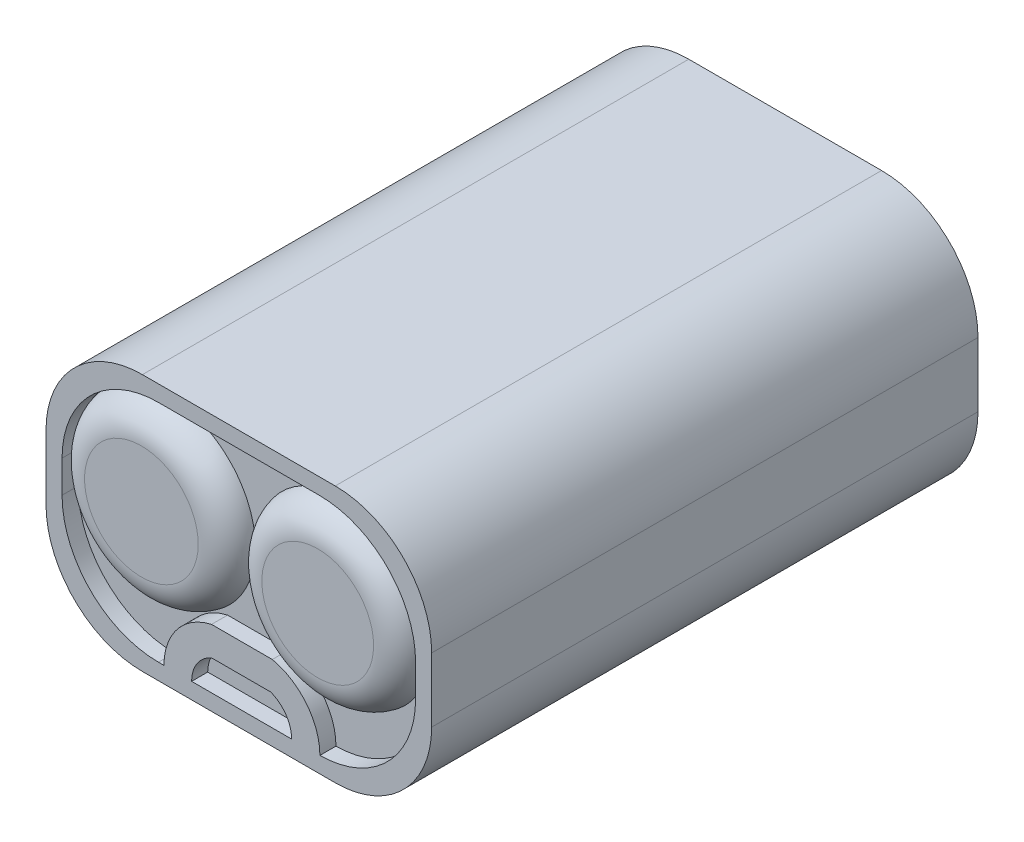
ISO-10303-21;
HEADER;
FILE_DESCRIPTION(('STEP AP214'),'2;1');
FILE_NAME('part.step','',(''),(''),'','','');
FILE_SCHEMA(('AUTOMOTIVE_DESIGN { 1 0 10303 214 1 1 1 1 }'));
ENDSEC;
DATA;
#1=APPLICATION_CONTEXT('core data for automotive mechanical design processes');
#2=APPLICATION_PROTOCOL_DEFINITION('international standard','automotive_design',2000,#1);
#3=PRODUCT_CONTEXT('',#1,'mechanical');
#4=PRODUCT('Part','Part','',(#3));
#5=PRODUCT_RELATED_PRODUCT_CATEGORY('part','',(#4));
#6=PRODUCT_DEFINITION_FORMATION('','',#4);
#7=PRODUCT_DEFINITION_CONTEXT('part definition',#1,'design');
#8=PRODUCT_DEFINITION('design','',#6,#7);
#9=PRODUCT_DEFINITION_SHAPE('','',#8);
#10=(LENGTH_UNIT() NAMED_UNIT(*) SI_UNIT(.MILLI.,.METRE.));
#11=(NAMED_UNIT(*) PLANE_ANGLE_UNIT() SI_UNIT($,.RADIAN.));
#12=(NAMED_UNIT(*) SI_UNIT($,.STERADIAN.) SOLID_ANGLE_UNIT());
#13=UNCERTAINTY_MEASURE_WITH_UNIT(LENGTH_MEASURE(1.E-05),#10,'distance_accuracy_value','');
#14=(GEOMETRIC_REPRESENTATION_CONTEXT(3) GLOBAL_UNCERTAINTY_ASSIGNED_CONTEXT((#13)) GLOBAL_UNIT_ASSIGNED_CONTEXT((#10,
#11,#12)) REPRESENTATION_CONTEXT('',''));
#15=CARTESIAN_POINT('',(0.,0.,0.));
#16=DIRECTION('',(0.,0.,1.));
#17=DIRECTION('',(1.,0.,0.));
#18=AXIS2_PLACEMENT_3D('',#15,#16,#17);
#19=CARTESIAN_POINT('',(15.24,20.32,21.59));
#20=DIRECTION('',(0.,0.,-1.));
#21=DIRECTION('',(-1.,0.,0.));
#22=AXIS2_PLACEMENT_3D('',#19,#20,#21);
#23=PLANE('',#22);
#24=DIRECTION('',(-1.,0.,0.));
#25=VECTOR('',#24,1.);
#26=CARTESIAN_POINT('',(0.,1.27,21.59));
#27=LINE('',#26,#25);
#28=CARTESIAN_POINT('',(4.17309607674067,1.27,21.59));
#29=VERTEX_POINT('',#28);
#30=CARTESIAN_POINT('',(-3.72973394839506,1.27,21.59));
#31=VERTEX_POINT('',#30);
#32=EDGE_CURVE('E106',#29,#31,#27,.T.);
#33=ORIENTED_EDGE('',*,*,#32,.T.);
#34=CARTESIAN_POINT('',(-1.11982693027526,1.27,21.59));
#35=DIRECTION('',(0.,0.,1.));
#36=DIRECTION('',(1.,0.,0.));
#37=AXIS2_PLACEMENT_3D('',#34,#35,#36);
#38=CIRCLE('',#37,2.6099070181198);
#39=CARTESIAN_POINT('',(-2.15658026023139,3.66515285024899,21.59));
#40=VERTEX_POINT('',#39);
#41=EDGE_CURVE('E334',#40,#31,#38,.T.);
#42=ORIENTED_EDGE('',*,*,#41,.F.);
#43=DIRECTION('',(1.,0.,0.));
#44=VECTOR('',#43,1.);
#45=CARTESIAN_POINT('',(0.,3.66515285024899,21.59));
#46=LINE('',#45,#44);
#47=CARTESIAN_POINT('',(2.52500779474754,3.66515285024899,21.59));
#48=VERTEX_POINT('',#47);
#49=EDGE_CURVE('E347',#40,#48,#46,.T.);
#50=ORIENTED_EDGE('',*,*,#49,.T.);
#51=CARTESIAN_POINT('',(1.60862418113436,1.27,21.59));
#52=DIRECTION('',(0.,0.,1.));
#53=DIRECTION('',(1.,0.,0.));
#54=AXIS2_PLACEMENT_3D('',#51,#52,#53);
#55=CIRCLE('',#54,2.56447189560631);
#56=EDGE_CURVE('E344',#29,#48,#55,.T.);
#57=ORIENTED_EDGE('',*,*,#56,.F.);
#58=EDGE_LOOP('',(#33,#42,#50,#57));
#59=FACE_BOUND('',#58,.T.);
#60=DIRECTION('',(1.,0.,0.));
#61=VECTOR('',#60,1.);
#62=CARTESIAN_POINT('',(15.24,0.,21.59));
#63=LINE('',#62,#61);
#64=CARTESIAN_POINT('',(-7.62,0.,21.59));
#65=VERTEX_POINT('',#64);
#66=CARTESIAN_POINT('',(7.62,0.,21.59));
#67=VERTEX_POINT('',#66);
#68=EDGE_CURVE('E354',#65,#67,#63,.T.);
#69=ORIENTED_EDGE('',*,*,#68,.T.);
#70=CARTESIAN_POINT('',(7.61999999999999,7.62,21.59));
#71=DIRECTION('',(0.,0.,-1.));
#72=DIRECTION('',(-1.,0.,0.));
#73=AXIS2_PLACEMENT_3D('',#70,#71,#72);
#74=CIRCLE('',#73,7.62);
#75=CARTESIAN_POINT('',(15.24,7.62,21.59));
#76=VERTEX_POINT('',#75);
#77=EDGE_CURVE('E406',#67,#76,#74,.F.);
#78=ORIENTED_EDGE('',*,*,#77,.T.);
#79=DIRECTION('',(0.,-1.,0.));
#80=VECTOR('',#79,1.);
#81=CARTESIAN_POINT('',(15.24,20.32,21.59));
#82=LINE('',#81,#80);
#83=CARTESIAN_POINT('',(15.24,12.7,21.59));
#84=VERTEX_POINT('',#83);
#85=EDGE_CURVE('E377',#84,#76,#82,.T.);
#86=ORIENTED_EDGE('',*,*,#85,.F.);
#87=CARTESIAN_POINT('',(7.61999999999999,12.7,21.59));
#88=DIRECTION('',(0.,0.,-1.));
#89=DIRECTION('',(-1.,0.,0.));
#90=AXIS2_PLACEMENT_3D('',#87,#88,#89);
#91=CIRCLE('',#90,7.62);
#92=CARTESIAN_POINT('',(7.62,20.32,21.59));
#93=VERTEX_POINT('',#92);
#94=EDGE_CURVE('E402',#84,#93,#91,.F.);
#95=ORIENTED_EDGE('',*,*,#94,.T.);
#96=DIRECTION('',(1.,0.,0.));
#97=VECTOR('',#96,1.);
#98=CARTESIAN_POINT('',(15.24,20.32,21.59));
#99=LINE('',#98,#97);
#100=CARTESIAN_POINT('',(-7.62,20.32,21.59));
#101=VERTEX_POINT('',#100);
#102=EDGE_CURVE('E360',#101,#93,#99,.T.);
#103=ORIENTED_EDGE('',*,*,#102,.F.);
#104=CARTESIAN_POINT('',(-7.62,12.7,21.59));
#105=DIRECTION('',(0.,0.,-1.));
#106=DIRECTION('',(-1.,0.,0.));
#107=AXIS2_PLACEMENT_3D('',#104,#105,#106);
#108=CIRCLE('',#107,7.62);
#109=CARTESIAN_POINT('',(-15.24,12.7,21.59));
#110=VERTEX_POINT('',#109);
#111=EDGE_CURVE('E400',#101,#110,#108,.F.);
#112=ORIENTED_EDGE('',*,*,#111,.T.);
#113=DIRECTION('',(0.,-1.,0.));
#114=VECTOR('',#113,1.);
#115=CARTESIAN_POINT('',(-15.24,20.32,21.59));
#116=LINE('',#115,#114);
#117=CARTESIAN_POINT('',(-15.24,7.62,21.59));
#118=VERTEX_POINT('',#117);
#119=EDGE_CURVE('E380',#110,#118,#116,.T.);
#120=ORIENTED_EDGE('',*,*,#119,.T.);
#121=CARTESIAN_POINT('',(-7.62,7.62,21.59));
#122=DIRECTION('',(0.,0.,-1.));
#123=DIRECTION('',(-1.,0.,0.));
#124=AXIS2_PLACEMENT_3D('',#121,#122,#123);
#125=CIRCLE('',#124,7.62);
#126=EDGE_CURVE('E404',#118,#65,#125,.F.);
#127=ORIENTED_EDGE('',*,*,#126,.T.);
#128=EDGE_LOOP('',(#69,#78,#86,#95,#103,#112,#120,#127));
#129=FACE_BOUND('',#128,.T.);
#130=CARTESIAN_POINT('',(1.60862418113436,1.27,21.59));
#131=DIRECTION('',(0.,0.,1.));
#132=DIRECTION('',(1.,0.,0.));
#133=AXIS2_PLACEMENT_3D('',#130,#131,#132);
#134=CIRCLE('',#133,4.79908538804474);
#135=CARTESIAN_POINT('',(6.4077095642035,1.27021853291058,21.59));
#136=VERTEX_POINT('',#135);
#137=CARTESIAN_POINT('',(2.64537751109049,5.95576174112272,21.59));
#138=VERTEX_POINT('',#137);
#139=EDGE_CURVE('E98',#136,#138,#134,.T.);
#140=ORIENTED_EDGE('',*,*,#139,.T.);
#141=DIRECTION('',(1.,0.,0.));
#142=VECTOR('',#141,1.);
#143=CARTESIAN_POINT('',(0.,5.95576174112272,21.59));
#144=LINE('',#143,#142);
#145=CARTESIAN_POINT('',(-2.15658026023139,5.95576174112272,21.59));
#146=VERTEX_POINT('',#145);
#147=EDGE_CURVE('E255',#146,#138,#144,.T.);
#148=ORIENTED_EDGE('',*,*,#147,.F.);
#149=CARTESIAN_POINT('',(-1.11982693027526,1.27,21.59));
#150=DIRECTION('',(0.,0.,1.));
#151=DIRECTION('',(1.,0.,0.));
#152=AXIS2_PLACEMENT_3D('',#149,#150,#151);
#153=CIRCLE('',#152,4.79908538804474);
#154=CARTESIAN_POINT('',(-5.91891231832,1.27,21.59));
#155=VERTEX_POINT('',#154);
#156=EDGE_CURVE('E307',#146,#155,#153,.T.);
#157=ORIENTED_EDGE('',*,*,#156,.T.);
#158=DIRECTION('',(-1.,0.,0.));
#159=VECTOR('',#158,1.);
#160=CARTESIAN_POINT('',(0.,1.27,21.59));
#161=LINE('',#160,#159);
#162=CARTESIAN_POINT('',(-6.35,1.27,21.59));
#163=VERTEX_POINT('',#162);
#164=EDGE_CURVE('E304',#155,#163,#161,.T.);
#165=ORIENTED_EDGE('',*,*,#164,.T.);
#166=CARTESIAN_POINT('',(-6.35,8.89,21.59));
#167=DIRECTION('',(0.,0.,1.));
#168=DIRECTION('',(1.,0.,0.));
#169=AXIS2_PLACEMENT_3D('',#166,#167,#168);
#170=CIRCLE('',#169,7.62);
#171=CARTESIAN_POINT('',(-13.97,8.89,21.59));
#172=VERTEX_POINT('',#171);
#173=EDGE_CURVE('E301',#163,#172,#170,.F.);
#174=ORIENTED_EDGE('',*,*,#173,.T.);
#175=DIRECTION('',(0.,1.,0.));
#176=VECTOR('',#175,1.);
#177=CARTESIAN_POINT('',(-13.97,0.,21.59));
#178=LINE('',#177,#176);
#179=CARTESIAN_POINT('',(-13.97,11.43,21.59));
#180=VERTEX_POINT('',#179);
#181=EDGE_CURVE('E298',#172,#180,#178,.T.);
#182=ORIENTED_EDGE('',*,*,#181,.T.);
#183=CARTESIAN_POINT('',(-6.35,11.43,21.59));
#184=DIRECTION('',(0.,0.,1.));
#185=DIRECTION('',(1.,0.,0.));
#186=AXIS2_PLACEMENT_3D('',#183,#184,#185);
#187=CIRCLE('',#186,7.62);
#188=CARTESIAN_POINT('',(-6.35000000000001,19.05,21.59));
#189=VERTEX_POINT('',#188);
#190=EDGE_CURVE('E295',#189,#180,#187,.T.);
#191=ORIENTED_EDGE('',*,*,#190,.F.);
#192=DIRECTION('',(-1.,0.,0.));
#193=VECTOR('',#192,1.);
#194=CARTESIAN_POINT('',(0.,19.05,21.59));
#195=LINE('',#194,#193);
#196=CARTESIAN_POINT('',(6.35,19.05,21.59));
#197=VERTEX_POINT('',#196);
#198=EDGE_CURVE('E292',#197,#189,#195,.T.);
#199=ORIENTED_EDGE('',*,*,#198,.F.);
#200=CARTESIAN_POINT('',(6.35,11.43,21.59));
#201=DIRECTION('',(0.,0.,1.));
#202=DIRECTION('',(1.,0.,0.));
#203=AXIS2_PLACEMENT_3D('',#200,#201,#202);
#204=CIRCLE('',#203,7.62);
#205=CARTESIAN_POINT('',(13.97,11.43,21.59));
#206=VERTEX_POINT('',#205);
#207=EDGE_CURVE('E289',#206,#197,#204,.T.);
#208=ORIENTED_EDGE('',*,*,#207,.F.);
#209=DIRECTION('',(0.,1.,0.));
#210=VECTOR('',#209,1.);
#211=CARTESIAN_POINT('',(13.97,0.,21.59));
#212=LINE('',#211,#210);
#213=CARTESIAN_POINT('',(13.97,8.89,21.59));
#214=VERTEX_POINT('',#213);
#215=EDGE_CURVE('E286',#214,#206,#212,.T.);
#216=ORIENTED_EDGE('',*,*,#215,.F.);
#217=CARTESIAN_POINT('',(6.35,8.89,21.59));
#218=DIRECTION('',(0.,0.,1.));
#219=DIRECTION('',(1.,0.,0.));
#220=AXIS2_PLACEMENT_3D('',#217,#218,#219);
#221=CIRCLE('',#220,7.62);
#222=EDGE_CURVE('E283',#136,#214,#221,.T.);
#223=ORIENTED_EDGE('',*,*,#222,.F.);
#224=EDGE_LOOP('',(#140,#148,#157,#165,#174,#182,#191,#199,#208,#216,#223));
#225=FACE_BOUND('',#224,.T.);
#226=ADVANCED_FACE('F83',(#59,#129,#225),#23,.F.);
#227=CARTESIAN_POINT('',(-15.24,20.32,21.59));
#228=DIRECTION('',(1.,0.,0.));
#229=DIRECTION('',(0.,0.,-1.));
#230=AXIS2_PLACEMENT_3D('',#227,#228,#229);
#231=PLANE('',#230);
#232=DIRECTION('',(0.,-1.,0.));
#233=VECTOR('',#232,1.);
#234=CARTESIAN_POINT('',(-15.24,20.32,-21.59));
#235=LINE('',#234,#233);
#236=CARTESIAN_POINT('',(-15.24,12.7,-21.59));
#237=VERTEX_POINT('',#236);
#238=CARTESIAN_POINT('',(-15.24,7.62,-21.59));
#239=VERTEX_POINT('',#238);
#240=EDGE_CURVE('E367',#237,#239,#235,.T.);
#241=ORIENTED_EDGE('',*,*,#240,.T.);
#242=DIRECTION('',(0.,0.,1.));
#243=VECTOR('',#242,1.);
#244=CARTESIAN_POINT('',(-15.24,7.62,21.59));
#245=LINE('',#244,#243);
#246=EDGE_CURVE('E410',#239,#118,#245,.T.);
#247=ORIENTED_EDGE('',*,*,#246,.T.);
#248=ORIENTED_EDGE('',*,*,#119,.F.);
#249=DIRECTION('',(0.,0.,1.));
#250=VECTOR('',#249,1.);
#251=CARTESIAN_POINT('',(-15.24,12.7,-21.59));
#252=LINE('',#251,#250);
#253=EDGE_CURVE('E408',#110,#237,#252,.F.);
#254=ORIENTED_EDGE('',*,*,#253,.T.);
#255=EDGE_LOOP('',(#241,#247,#248,#254));
#256=FACE_BOUND('',#255,.T.);
#257=ADVANCED_FACE('F436',(#256),#231,.F.);
#258=CARTESIAN_POINT('',(15.24,20.32,21.59));
#259=DIRECTION('',(-1.,0.,0.));
#260=DIRECTION('',(0.,0.,1.));
#261=AXIS2_PLACEMENT_3D('',#258,#259,#260);
#262=PLANE('',#261);
#263=ORIENTED_EDGE('',*,*,#85,.T.);
#264=DIRECTION('',(0.,0.,-1.));
#265=VECTOR('',#264,1.);
#266=CARTESIAN_POINT('',(15.24,7.62,21.59));
#267=LINE('',#266,#265);
#268=CARTESIAN_POINT('',(15.24,7.62,-21.59));
#269=VERTEX_POINT('',#268);
#270=EDGE_CURVE('E385',#76,#269,#267,.T.);
#271=ORIENTED_EDGE('',*,*,#270,.T.);
#272=DIRECTION('',(0.,-1.,0.));
#273=VECTOR('',#272,1.);
#274=CARTESIAN_POINT('',(15.24,20.32,-21.59));
#275=LINE('',#274,#273);
#276=CARTESIAN_POINT('',(15.24,12.7,-21.59));
#277=VERTEX_POINT('',#276);
#278=EDGE_CURVE('E374',#277,#269,#275,.T.);
#279=ORIENTED_EDGE('',*,*,#278,.F.);
#280=DIRECTION('',(0.,0.,-1.));
#281=VECTOR('',#280,1.);
#282=CARTESIAN_POINT('',(15.24,12.7,21.59));
#283=LINE('',#282,#281);
#284=EDGE_CURVE('E383',#277,#84,#283,.F.);
#285=ORIENTED_EDGE('',*,*,#284,.T.);
#286=EDGE_LOOP('',(#263,#271,#279,#285));
#287=FACE_BOUND('',#286,.T.);
#288=ADVANCED_FACE('F442',(#287),#262,.F.);
#289=CARTESIAN_POINT('',(15.24,20.32,-21.59));
#290=DIRECTION('',(0.,0.,1.));
#291=DIRECTION('',(1.,0.,0.));
#292=AXIS2_PLACEMENT_3D('',#289,#290,#291);
#293=PLANE('',#292);
#294=ORIENTED_EDGE('',*,*,#278,.T.);
#295=CARTESIAN_POINT('',(7.61999999999999,7.62,-21.59));
#296=DIRECTION('',(0.,0.,1.));
#297=DIRECTION('',(1.,0.,0.));
#298=AXIS2_PLACEMENT_3D('',#295,#296,#297);
#299=CIRCLE('',#298,7.62);
#300=CARTESIAN_POINT('',(7.62,0.,-21.59));
#301=VERTEX_POINT('',#300);
#302=EDGE_CURVE('E394',#269,#301,#299,.F.);
#303=ORIENTED_EDGE('',*,*,#302,.T.);
#304=DIRECTION('',(-1.,0.,0.));
#305=VECTOR('',#304,1.);
#306=CARTESIAN_POINT('',(15.24,0.,-21.59));
#307=LINE('',#306,#305);
#308=CARTESIAN_POINT('',(-7.62,0.,-21.59));
#309=VERTEX_POINT('',#308);
#310=EDGE_CURVE('E364',#301,#309,#307,.T.);
#311=ORIENTED_EDGE('',*,*,#310,.T.);
#312=CARTESIAN_POINT('',(-7.62,7.62,-21.59));
#313=DIRECTION('',(0.,0.,1.));
#314=DIRECTION('',(1.,0.,0.));
#315=AXIS2_PLACEMENT_3D('',#312,#313,#314);
#316=CIRCLE('',#315,7.62);
#317=EDGE_CURVE('E392',#309,#239,#316,.F.);
#318=ORIENTED_EDGE('',*,*,#317,.T.);
#319=ORIENTED_EDGE('',*,*,#240,.F.);
#320=CARTESIAN_POINT('',(-7.62,12.7,-21.59));
#321=DIRECTION('',(0.,0.,1.));
#322=DIRECTION('',(1.,0.,0.));
#323=AXIS2_PLACEMENT_3D('',#320,#321,#322);
#324=CIRCLE('',#323,7.62);
#325=CARTESIAN_POINT('',(-7.62,20.32,-21.59));
#326=VERTEX_POINT('',#325);
#327=EDGE_CURVE('E388',#237,#326,#324,.F.);
#328=ORIENTED_EDGE('',*,*,#327,.T.);
#329=DIRECTION('',(-1.,0.,0.));
#330=VECTOR('',#329,1.);
#331=CARTESIAN_POINT('',(15.24,20.32,-21.59));
#332=LINE('',#331,#330);
#333=CARTESIAN_POINT('',(7.62,20.32,-21.59));
#334=VERTEX_POINT('',#333);
#335=EDGE_CURVE('E363',#334,#326,#332,.T.);
#336=ORIENTED_EDGE('',*,*,#335,.F.);
#337=CARTESIAN_POINT('',(7.61999999999999,12.7,-21.59));
#338=DIRECTION('',(0.,0.,1.));
#339=DIRECTION('',(1.,0.,0.));
#340=AXIS2_PLACEMENT_3D('',#337,#338,#339);
#341=CIRCLE('',#340,7.62);
#342=EDGE_CURVE('E390',#334,#277,#341,.F.);
#343=ORIENTED_EDGE('',*,*,#342,.T.);
#344=EDGE_LOOP('',(#294,#303,#311,#318,#319,#328,#336,#343));
#345=FACE_BOUND('',#344,.T.);
#346=ADVANCED_FACE('F476',(#345),#293,.F.);
#347=CARTESIAN_POINT('',(0.,20.32,0.));
#348=DIRECTION('',(0.,1.,0.));
#349=DIRECTION('',(0.,0.,1.));
#350=AXIS2_PLACEMENT_3D('',#347,#348,#349);
#351=PLANE('',#350);
#352=ORIENTED_EDGE('',*,*,#102,.T.);
#353=DIRECTION('',(0.,0.,-1.));
#354=VECTOR('',#353,1.);
#355=CARTESIAN_POINT('',(7.61999999999999,20.32,-21.59));
#356=LINE('',#355,#354);
#357=EDGE_CURVE('E416',#93,#334,#356,.T.);
#358=ORIENTED_EDGE('',*,*,#357,.T.);
#359=ORIENTED_EDGE('',*,*,#335,.T.);
#360=DIRECTION('',(0.,0.,1.));
#361=VECTOR('',#360,1.);
#362=CARTESIAN_POINT('',(-7.62,20.32,21.59));
#363=LINE('',#362,#361);
#364=EDGE_CURVE('E413',#326,#101,#363,.T.);
#365=ORIENTED_EDGE('',*,*,#364,.T.);
#366=EDGE_LOOP('',(#352,#358,#359,#365));
#367=FACE_BOUND('',#366,.T.);
#368=ADVANCED_FACE('F478',(#367),#351,.T.);
#369=CARTESIAN_POINT('',(0.,0.,0.));
#370=DIRECTION('',(0.,1.,0.));
#371=DIRECTION('',(0.,0.,1.));
#372=AXIS2_PLACEMENT_3D('',#369,#370,#371);
#373=PLANE('',#372);
#374=ORIENTED_EDGE('',*,*,#310,.F.);
#375=DIRECTION('',(0.,0.,-1.));
#376=VECTOR('',#375,1.);
#377=CARTESIAN_POINT('',(7.61999999999999,0.,0.));
#378=LINE('',#377,#376);
#379=EDGE_CURVE('E398',#301,#67,#378,.F.);
#380=ORIENTED_EDGE('',*,*,#379,.T.);
#381=ORIENTED_EDGE('',*,*,#68,.F.);
#382=DIRECTION('',(0.,0.,1.));
#383=VECTOR('',#382,1.);
#384=CARTESIAN_POINT('',(-7.62,0.,0.));
#385=LINE('',#384,#383);
#386=EDGE_CURVE('E396',#65,#309,#385,.F.);
#387=ORIENTED_EDGE('',*,*,#386,.T.);
#388=EDGE_LOOP('',(#374,#380,#381,#387));
#389=FACE_BOUND('',#388,.T.);
#390=ADVANCED_FACE('F453',(#389),#373,.F.);
#391=CARTESIAN_POINT('',(7.61999999999999,7.62,21.59));
#392=DIRECTION('',(0.,0.,-1.));
#393=DIRECTION('',(-1.,0.,0.));
#394=AXIS2_PLACEMENT_3D('',#391,#392,#393);
#395=CYLINDRICAL_SURFACE('',#394,7.62);
#396=ORIENTED_EDGE('',*,*,#77,.F.);
#397=ORIENTED_EDGE('',*,*,#379,.F.);
#398=ORIENTED_EDGE('',*,*,#302,.F.);
#399=ORIENTED_EDGE('',*,*,#270,.F.);
#400=EDGE_LOOP('',(#396,#397,#398,#399));
#401=FACE_BOUND('',#400,.T.);
#402=ADVANCED_FACE('F449',(#401),#395,.T.);
#403=CARTESIAN_POINT('',(-7.62,7.62,21.59));
#404=DIRECTION('',(0.,0.,1.));
#405=DIRECTION('',(1.,0.,0.));
#406=AXIS2_PLACEMENT_3D('',#403,#404,#405);
#407=CYLINDRICAL_SURFACE('',#406,7.62);
#408=ORIENTED_EDGE('',*,*,#317,.F.);
#409=ORIENTED_EDGE('',*,*,#386,.F.);
#410=ORIENTED_EDGE('',*,*,#126,.F.);
#411=ORIENTED_EDGE('',*,*,#246,.F.);
#412=EDGE_LOOP('',(#408,#409,#410,#411));
#413=FACE_BOUND('',#412,.T.);
#414=ADVANCED_FACE('F452',(#413),#407,.T.);
#415=CARTESIAN_POINT('',(7.61999999999999,12.7,0.));
#416=DIRECTION('',(0.,0.,1.));
#417=DIRECTION('',(1.,0.,0.));
#418=AXIS2_PLACEMENT_3D('',#415,#416,#417);
#419=CYLINDRICAL_SURFACE('',#418,7.62);
#420=ORIENTED_EDGE('',*,*,#94,.F.);
#421=ORIENTED_EDGE('',*,*,#284,.F.);
#422=ORIENTED_EDGE('',*,*,#342,.F.);
#423=ORIENTED_EDGE('',*,*,#357,.F.);
#424=EDGE_LOOP('',(#420,#421,#422,#423));
#425=FACE_BOUND('',#424,.T.);
#426=ADVANCED_FACE('F457',(#425),#419,.T.);
#427=CARTESIAN_POINT('',(-7.62,12.7,0.));
#428=DIRECTION('',(0.,0.,-1.));
#429=DIRECTION('',(-1.,0.,0.));
#430=AXIS2_PLACEMENT_3D('',#427,#428,#429);
#431=CYLINDRICAL_SURFACE('',#430,7.62);
#432=ORIENTED_EDGE('',*,*,#327,.F.);
#433=ORIENTED_EDGE('',*,*,#253,.F.);
#434=ORIENTED_EDGE('',*,*,#111,.F.);
#435=ORIENTED_EDGE('',*,*,#364,.F.);
#436=EDGE_LOOP('',(#432,#433,#434,#435));
#437=FACE_BOUND('',#436,.T.);
#438=ADVANCED_FACE('F460',(#437),#431,.T.);
#439=CARTESIAN_POINT('',(0.,1.27,20.32));
#440=DIRECTION('',(0.,1.,0.));
#441=DIRECTION('',(-1.,0.,0.));
#442=AXIS2_PLACEMENT_3D('',#439,#440,#441);
#443=PLANE('',#442);
#444=ORIENTED_EDGE('',*,*,#32,.F.);
#445=DIRECTION('',(0.,0.,1.));
#446=VECTOR('',#445,1.);
#447=CARTESIAN_POINT('',(4.17309607674067,1.27,20.32));
#448=LINE('',#447,#446);
#449=CARTESIAN_POINT('',(4.17309607674067,1.27,20.32));
#450=VERTEX_POINT('',#449);
#451=EDGE_CURVE('E342',#450,#29,#448,.T.);
#452=ORIENTED_EDGE('',*,*,#451,.F.);
#453=DIRECTION('',(-1.,0.,0.));
#454=VECTOR('',#453,1.);
#455=CARTESIAN_POINT('',(0.,1.27,20.32));
#456=LINE('',#455,#454);
#457=CARTESIAN_POINT('',(-3.72973394839506,1.27,20.32));
#458=VERTEX_POINT('',#457);
#459=EDGE_CURVE('E331',#450,#458,#456,.T.);
#460=ORIENTED_EDGE('',*,*,#459,.T.);
#461=DIRECTION('',(0.,0.,1.));
#462=VECTOR('',#461,1.);
#463=CARTESIAN_POINT('',(-3.72973394839506,1.27,20.32));
#464=LINE('',#463,#462);
#465=EDGE_CURVE('E352',#458,#31,#464,.T.);
#466=ORIENTED_EDGE('',*,*,#465,.T.);
#467=EDGE_LOOP('',(#444,#452,#460,#466));
#468=FACE_BOUND('',#467,.T.);
#469=ADVANCED_FACE('F463',(#468),#443,.T.);
#470=CARTESIAN_POINT('',(-1.11982693027526,1.27,20.32));
#471=DIRECTION('',(0.,0.,1.));
#472=DIRECTION('',(1.,0.,0.));
#473=AXIS2_PLACEMENT_3D('',#470,#471,#472);
#474=CYLINDRICAL_SURFACE('',#473,2.6099070181198);
#475=ORIENTED_EDGE('',*,*,#41,.T.);
#476=ORIENTED_EDGE('',*,*,#465,.F.);
#477=CARTESIAN_POINT('',(-1.11982693027526,1.27,20.32));
#478=DIRECTION('',(0.,0.,1.));
#479=DIRECTION('',(1.,0.,0.));
#480=AXIS2_PLACEMENT_3D('',#477,#478,#479);
#481=CIRCLE('',#480,2.6099070181198);
#482=CARTESIAN_POINT('',(-2.15658026023139,3.66515285024899,20.32));
#483=VERTEX_POINT('',#482);
#484=EDGE_CURVE('E339',#483,#458,#481,.T.);
#485=ORIENTED_EDGE('',*,*,#484,.F.);
#486=DIRECTION('',(0.,0.,1.));
#487=VECTOR('',#486,1.);
#488=CARTESIAN_POINT('',(-2.15658026023139,3.66515285024899,20.32));
#489=LINE('',#488,#487);
#490=EDGE_CURVE('E355',#483,#40,#489,.T.);
#491=ORIENTED_EDGE('',*,*,#490,.T.);
#492=EDGE_LOOP('',(#475,#476,#485,#491));
#493=FACE_BOUND('',#492,.T.);
#494=ADVANCED_FACE('F468',(#493),#474,.F.);
#495=CARTESIAN_POINT('',(0.,3.66515285024899,20.32));
#496=DIRECTION('',(0.,-1.,0.));
#497=DIRECTION('',(0.,0.,-1.));
#498=AXIS2_PLACEMENT_3D('',#495,#496,#497);
#499=PLANE('',#498);
#500=ORIENTED_EDGE('',*,*,#49,.F.);
#501=ORIENTED_EDGE('',*,*,#490,.F.);
#502=DIRECTION('',(1.,0.,0.));
#503=VECTOR('',#502,1.);
#504=CARTESIAN_POINT('',(0.,3.66515285024899,20.32));
#505=LINE('',#504,#503);
#506=CARTESIAN_POINT('',(2.52500779474754,3.66515285024899,20.32));
#507=VERTEX_POINT('',#506);
#508=EDGE_CURVE('E337',#483,#507,#505,.T.);
#509=ORIENTED_EDGE('',*,*,#508,.T.);
#510=DIRECTION('',(0.,0.,1.));
#511=VECTOR('',#510,1.);
#512=CARTESIAN_POINT('',(2.52500779474754,3.66515285024899,20.32));
#513=LINE('',#512,#511);
#514=EDGE_CURVE('E357',#507,#48,#513,.T.);
#515=ORIENTED_EDGE('',*,*,#514,.T.);
#516=EDGE_LOOP('',(#500,#501,#509,#515));
#517=FACE_BOUND('',#516,.T.);
#518=ADVANCED_FACE('F567',(#517),#499,.T.);
#519=CARTESIAN_POINT('',(1.60862418113436,1.27,20.32));
#520=DIRECTION('',(0.,0.,1.));
#521=DIRECTION('',(1.,0.,0.));
#522=AXIS2_PLACEMENT_3D('',#519,#520,#521);
#523=CYLINDRICAL_SURFACE('',#522,2.56447189560631);
#524=ORIENTED_EDGE('',*,*,#56,.T.);
#525=ORIENTED_EDGE('',*,*,#514,.F.);
#526=CARTESIAN_POINT('',(1.60862418113436,1.27,20.32));
#527=DIRECTION('',(0.,0.,1.));
#528=DIRECTION('',(1.,0.,0.));
#529=AXIS2_PLACEMENT_3D('',#526,#527,#528);
#530=CIRCLE('',#529,2.56447189560631);
#531=EDGE_CURVE('E333',#450,#507,#530,.T.);
#532=ORIENTED_EDGE('',*,*,#531,.F.);
#533=ORIENTED_EDGE('',*,*,#451,.T.);
#534=EDGE_LOOP('',(#524,#525,#532,#533));
#535=FACE_BOUND('',#534,.T.);
#536=ADVANCED_FACE('F563',(#535),#523,.F.);
#537=CARTESIAN_POINT('',(0.,0.,20.32));
#538=DIRECTION('',(0.,0.,1.));
#539=DIRECTION('',(1.,0.,0.));
#540=AXIS2_PLACEMENT_3D('',#537,#538,#539);
#541=PLANE('',#540);
#542=ORIENTED_EDGE('',*,*,#459,.F.);
#543=ORIENTED_EDGE('',*,*,#531,.T.);
#544=ORIENTED_EDGE('',*,*,#508,.F.);
#545=ORIENTED_EDGE('',*,*,#484,.T.);
#546=EDGE_LOOP('',(#542,#543,#544,#545));
#547=FACE_BOUND('',#546,.T.);
#548=ADVANCED_FACE('F560',(#547),#541,.T.);
#549=CARTESIAN_POINT('',(1.60862418113436,1.27,20.32));
#550=DIRECTION('',(0.,0.,1.));
#551=DIRECTION('',(1.,0.,0.));
#552=AXIS2_PLACEMENT_3D('',#549,#550,#551);
#553=CYLINDRICAL_SURFACE('',#552,4.79908538804474);
#554=ORIENTED_EDGE('',*,*,#139,.F.);
#555=DIRECTION('',(0.,0.,1.));
#556=VECTOR('',#555,1.);
#557=CARTESIAN_POINT('',(6.4077095642035,1.27021853291058,20.32));
#558=LINE('',#557,#556);
#559=CARTESIAN_POINT('',(6.4077095642035,1.27021853291058,20.32));
#560=VERTEX_POINT('',#559);
#561=EDGE_CURVE('E235',#560,#136,#558,.T.);
#562=ORIENTED_EDGE('',*,*,#561,.F.);
#563=CARTESIAN_POINT('',(1.60862418113436,1.27,20.32));
#564=DIRECTION('',(0.,0.,1.));
#565=DIRECTION('',(1.,0.,0.));
#566=AXIS2_PLACEMENT_3D('',#563,#564,#565);
#567=CIRCLE('',#566,4.79908538804474);
#568=CARTESIAN_POINT('',(2.64537751109049,5.95576174112272,20.32));
#569=VERTEX_POINT('',#568);
#570=EDGE_CURVE('E238',#560,#569,#567,.T.);
#571=ORIENTED_EDGE('',*,*,#570,.T.);
#572=DIRECTION('',(0.,0.,1.));
#573=VECTOR('',#572,1.);
#574=CARTESIAN_POINT('',(2.64537751109049,5.95576174112272,20.32));
#575=LINE('',#574,#573);
#576=EDGE_CURVE('E312',#569,#138,#575,.T.);
#577=ORIENTED_EDGE('',*,*,#576,.T.);
#578=EDGE_LOOP('',(#554,#562,#571,#577));
#579=FACE_BOUND('',#578,.T.);
#580=ADVANCED_FACE('F237',(#579),#553,.T.);
#581=CARTESIAN_POINT('',(0.,5.95576174112272,20.32));
#582=DIRECTION('',(0.,-1.,0.));
#583=DIRECTION('',(0.,0.,-1.));
#584=AXIS2_PLACEMENT_3D('',#581,#582,#583);
#585=PLANE('',#584);
#586=ORIENTED_EDGE('',*,*,#147,.T.);
#587=ORIENTED_EDGE('',*,*,#576,.F.);
#588=DIRECTION('',(1.,0.,0.));
#589=VECTOR('',#588,1.);
#590=CARTESIAN_POINT('',(0.,5.95576174112272,20.32));
#591=LINE('',#590,#589);
#592=CARTESIAN_POINT('',(-2.15658026023139,5.95576174112272,20.32));
#593=VERTEX_POINT('',#592);
#594=EDGE_CURVE('E245',#593,#569,#591,.T.);
#595=ORIENTED_EDGE('',*,*,#594,.F.);
#596=DIRECTION('',(0.,0.,1.));
#597=VECTOR('',#596,1.);
#598=CARTESIAN_POINT('',(-2.15658026023139,5.95576174112272,20.32));
#599=LINE('',#598,#597);
#600=EDGE_CURVE('E314',#593,#146,#599,.T.);
#601=ORIENTED_EDGE('',*,*,#600,.T.);
#602=EDGE_LOOP('',(#586,#587,#595,#601));
#603=FACE_BOUND('',#602,.T.);
#604=ADVANCED_FACE('F531',(#603),#585,.F.);
#605=CARTESIAN_POINT('',(-1.11982693027526,1.27,20.32));
#606=DIRECTION('',(0.,0.,1.));
#607=DIRECTION('',(1.,0.,0.));
#608=AXIS2_PLACEMENT_3D('',#605,#606,#607);
#609=CYLINDRICAL_SURFACE('',#608,4.79908538804474);
#610=ORIENTED_EDGE('',*,*,#156,.F.);
#611=ORIENTED_EDGE('',*,*,#600,.F.);
#612=CARTESIAN_POINT('',(-1.11982693027526,1.27,20.32));
#613=DIRECTION('',(0.,0.,1.));
#614=DIRECTION('',(1.,0.,0.));
#615=AXIS2_PLACEMENT_3D('',#612,#613,#614);
#616=CIRCLE('',#615,4.79908538804474);
#617=CARTESIAN_POINT('',(-5.91891231832,1.27,20.32));
#618=VERTEX_POINT('',#617);
#619=EDGE_CURVE('E279',#593,#618,#616,.T.);
#620=ORIENTED_EDGE('',*,*,#619,.T.);
#621=DIRECTION('',(0.,0.,1.));
#622=VECTOR('',#621,1.);
#623=CARTESIAN_POINT('',(-5.91891231832,1.27,20.32));
#624=LINE('',#623,#622);
#625=EDGE_CURVE('E316',#618,#155,#624,.T.);
#626=ORIENTED_EDGE('',*,*,#625,.T.);
#627=EDGE_LOOP('',(#610,#611,#620,#626));
#628=FACE_BOUND('',#627,.T.);
#629=ADVANCED_FACE('F533',(#628),#609,.T.);
#630=CARTESIAN_POINT('',(0.,1.27,20.32));
#631=DIRECTION('',(0.,1.,0.));
#632=DIRECTION('',(-1.,0.,0.));
#633=AXIS2_PLACEMENT_3D('',#630,#631,#632);
#634=PLANE('',#633);
#635=ORIENTED_EDGE('',*,*,#164,.F.);
#636=ORIENTED_EDGE('',*,*,#625,.F.);
#637=DIRECTION('',(-1.,0.,0.));
#638=VECTOR('',#637,1.);
#639=CARTESIAN_POINT('',(0.,1.27,20.32));
#640=LINE('',#639,#638);
#641=CARTESIAN_POINT('',(-6.35,1.27,20.32));
#642=VERTEX_POINT('',#641);
#643=EDGE_CURVE('E277',#618,#642,#640,.T.);
#644=ORIENTED_EDGE('',*,*,#643,.T.);
#645=DIRECTION('',(0.,0.,1.));
#646=VECTOR('',#645,1.);
#647=CARTESIAN_POINT('',(-6.35,1.27,20.32));
#648=LINE('',#647,#646);
#649=EDGE_CURVE('E318',#642,#163,#648,.T.);
#650=ORIENTED_EDGE('',*,*,#649,.T.);
#651=EDGE_LOOP('',(#635,#636,#644,#650));
#652=FACE_BOUND('',#651,.T.);
#653=ADVANCED_FACE('F527',(#652),#634,.T.);
#654=CARTESIAN_POINT('',(-6.35,8.89,20.32));
#655=DIRECTION('',(0.,0.,1.));
#656=DIRECTION('',(1.,0.,0.));
#657=AXIS2_PLACEMENT_3D('',#654,#655,#656);
#658=CYLINDRICAL_SURFACE('',#657,7.62);
#659=ORIENTED_EDGE('',*,*,#173,.F.);
#660=ORIENTED_EDGE('',*,*,#649,.F.);
#661=CARTESIAN_POINT('',(-6.35,8.89,20.32));
#662=DIRECTION('',(0.,0.,1.));
#663=DIRECTION('',(1.,0.,0.));
#664=AXIS2_PLACEMENT_3D('',#661,#662,#663);
#665=CIRCLE('',#664,7.62);
#666=CARTESIAN_POINT('',(-13.97,8.89,20.32));
#667=VERTEX_POINT('',#666);
#668=EDGE_CURVE('E275',#642,#667,#665,.F.);
#669=ORIENTED_EDGE('',*,*,#668,.T.);
#670=DIRECTION('',(0.,0.,1.));
#671=VECTOR('',#670,1.);
#672=CARTESIAN_POINT('',(-13.97,8.89,20.32));
#673=LINE('',#672,#671);
#674=EDGE_CURVE('E320',#667,#172,#673,.T.);
#675=ORIENTED_EDGE('',*,*,#674,.T.);
#676=EDGE_LOOP('',(#659,#660,#669,#675));
#677=FACE_BOUND('',#676,.T.);
#678=ADVANCED_FACE('F523',(#677),#658,.F.);
#679=CARTESIAN_POINT('',(-13.97,0.,20.32));
#680=DIRECTION('',(1.,0.,0.));
#681=DIRECTION('',(0.,1.,0.));
#682=AXIS2_PLACEMENT_3D('',#679,#680,#681);
#683=PLANE('',#682);
#684=ORIENTED_EDGE('',*,*,#181,.F.);
#685=ORIENTED_EDGE('',*,*,#674,.F.);
#686=DIRECTION('',(0.,1.,0.));
#687=VECTOR('',#686,1.);
#688=CARTESIAN_POINT('',(-13.97,0.,20.32));
#689=LINE('',#688,#687);
#690=CARTESIAN_POINT('',(-13.97,11.43,20.32));
#691=VERTEX_POINT('',#690);
#692=EDGE_CURVE('E273',#667,#691,#689,.T.);
#693=ORIENTED_EDGE('',*,*,#692,.T.);
#694=DIRECTION('',(0.,0.,1.));
#695=VECTOR('',#694,1.);
#696=CARTESIAN_POINT('',(-13.97,11.43,20.32));
#697=LINE('',#696,#695);
#698=EDGE_CURVE('E322',#691,#180,#697,.T.);
#699=ORIENTED_EDGE('',*,*,#698,.T.);
#700=EDGE_LOOP('',(#684,#685,#693,#699));
#701=FACE_BOUND('',#700,.T.);
#702=ADVANCED_FACE('F520',(#701),#683,.T.);
#703=CARTESIAN_POINT('',(-6.35,11.43,20.32));
#704=DIRECTION('',(0.,0.,1.));
#705=DIRECTION('',(1.,0.,0.));
#706=AXIS2_PLACEMENT_3D('',#703,#704,#705);
#707=CYLINDRICAL_SURFACE('',#706,7.62);
#708=ORIENTED_EDGE('',*,*,#190,.T.);
#709=ORIENTED_EDGE('',*,*,#698,.F.);
#710=CARTESIAN_POINT('',(-6.35,11.43,20.32));
#711=DIRECTION('',(0.,0.,1.));
#712=DIRECTION('',(1.,0.,0.));
#713=AXIS2_PLACEMENT_3D('',#710,#711,#712);
#714=CIRCLE('',#713,7.62);
#715=CARTESIAN_POINT('',(-6.35000000000001,19.05,20.32));
#716=VERTEX_POINT('',#715);
#717=EDGE_CURVE('E270',#716,#691,#714,.T.);
#718=ORIENTED_EDGE('',*,*,#717,.F.);
#719=DIRECTION('',(0.,0.,1.));
#720=VECTOR('',#719,1.);
#721=CARTESIAN_POINT('',(-6.35000000000001,19.05,20.32));
#722=LINE('',#721,#720);
#723=EDGE_CURVE('E324',#716,#189,#722,.T.);
#724=ORIENTED_EDGE('',*,*,#723,.T.);
#725=EDGE_LOOP('',(#708,#709,#718,#724));
#726=FACE_BOUND('',#725,.T.);
#727=ADVANCED_FACE('F513',(#726),#707,.F.);
#728=CARTESIAN_POINT('',(0.,19.05,20.32));
#729=DIRECTION('',(0.,1.,0.));
#730=DIRECTION('',(0.,0.,1.));
#731=AXIS2_PLACEMENT_3D('',#728,#729,#730);
#732=PLANE('',#731);
#733=ORIENTED_EDGE('',*,*,#198,.T.);
#734=ORIENTED_EDGE('',*,*,#723,.F.);
#735=DIRECTION('',(-1.,0.,0.));
#736=VECTOR('',#735,1.);
#737=CARTESIAN_POINT('',(0.,19.05,20.32));
#738=LINE('',#737,#736);
#739=CARTESIAN_POINT('',(6.35,19.05,20.32));
#740=VERTEX_POINT('',#739);
#741=EDGE_CURVE('E267',#740,#716,#738,.T.);
#742=ORIENTED_EDGE('',*,*,#741,.F.);
#743=DIRECTION('',(0.,0.,1.));
#744=VECTOR('',#743,1.);
#745=CARTESIAN_POINT('',(6.35,19.05,20.32));
#746=LINE('',#745,#744);
#747=EDGE_CURVE('E326',#740,#197,#746,.T.);
#748=ORIENTED_EDGE('',*,*,#747,.T.);
#749=EDGE_LOOP('',(#733,#734,#742,#748));
#750=FACE_BOUND('',#749,.T.);
#751=ADVANCED_FACE('F508',(#750),#732,.F.);
#752=CARTESIAN_POINT('',(6.35,11.43,20.32));
#753=DIRECTION('',(0.,0.,1.));
#754=DIRECTION('',(1.,0.,0.));
#755=AXIS2_PLACEMENT_3D('',#752,#753,#754);
#756=CYLINDRICAL_SURFACE('',#755,7.62);
#757=ORIENTED_EDGE('',*,*,#207,.T.);
#758=ORIENTED_EDGE('',*,*,#747,.F.);
#759=CARTESIAN_POINT('',(6.35,11.43,20.32));
#760=DIRECTION('',(0.,0.,1.));
#761=DIRECTION('',(1.,0.,0.));
#762=AXIS2_PLACEMENT_3D('',#759,#760,#761);
#763=CIRCLE('',#762,7.62);
#764=CARTESIAN_POINT('',(13.97,11.43,20.32));
#765=VERTEX_POINT('',#764);
#766=EDGE_CURVE('E261',#765,#740,#763,.T.);
#767=ORIENTED_EDGE('',*,*,#766,.F.);
#768=DIRECTION('',(0.,0.,1.));
#769=VECTOR('',#768,1.);
#770=CARTESIAN_POINT('',(13.97,11.43,20.32));
#771=LINE('',#770,#769);
#772=EDGE_CURVE('E328',#765,#206,#771,.T.);
#773=ORIENTED_EDGE('',*,*,#772,.T.);
#774=EDGE_LOOP('',(#757,#758,#767,#773));
#775=FACE_BOUND('',#774,.T.);
#776=ADVANCED_FACE('F506',(#775),#756,.F.);
#777=CARTESIAN_POINT('',(13.97,0.,20.32));
#778=DIRECTION('',(1.,0.,0.));
#779=DIRECTION('',(0.,1.,0.));
#780=AXIS2_PLACEMENT_3D('',#777,#778,#779);
#781=PLANE('',#780);
#782=ORIENTED_EDGE('',*,*,#215,.T.);
#783=ORIENTED_EDGE('',*,*,#772,.F.);
#784=DIRECTION('',(0.,1.,0.));
#785=VECTOR('',#784,1.);
#786=CARTESIAN_POINT('',(13.97,0.,20.32));
#787=LINE('',#786,#785);
#788=CARTESIAN_POINT('',(13.97,8.89,20.32));
#789=VERTEX_POINT('',#788);
#790=EDGE_CURVE('E259',#789,#765,#787,.T.);
#791=ORIENTED_EDGE('',*,*,#790,.F.);
#792=DIRECTION('',(0.,0.,1.));
#793=VECTOR('',#792,1.);
#794=CARTESIAN_POINT('',(13.97,8.89,20.32));
#795=LINE('',#794,#793);
#796=EDGE_CURVE('E244',#789,#214,#795,.T.);
#797=ORIENTED_EDGE('',*,*,#796,.T.);
#798=EDGE_LOOP('',(#782,#783,#791,#797));
#799=FACE_BOUND('',#798,.T.);
#800=ADVANCED_FACE('F502',(#799),#781,.F.);
#801=CARTESIAN_POINT('',(6.35,8.89,20.32));
#802=DIRECTION('',(0.,0.,1.));
#803=DIRECTION('',(1.,0.,0.));
#804=AXIS2_PLACEMENT_3D('',#801,#802,#803);
#805=CYLINDRICAL_SURFACE('',#804,7.62);
#806=ORIENTED_EDGE('',*,*,#222,.T.);
#807=ORIENTED_EDGE('',*,*,#796,.F.);
#808=CARTESIAN_POINT('',(6.35,8.89,20.32));
#809=DIRECTION('',(0.,0.,1.));
#810=DIRECTION('',(1.,0.,0.));
#811=AXIS2_PLACEMENT_3D('',#808,#809,#810);
#812=CIRCLE('',#811,7.62);
#813=EDGE_CURVE('E252',#560,#789,#812,.T.);
#814=ORIENTED_EDGE('',*,*,#813,.F.);
#815=ORIENTED_EDGE('',*,*,#561,.T.);
#816=EDGE_LOOP('',(#806,#807,#814,#815));
#817=FACE_BOUND('',#816,.T.);
#818=ADVANCED_FACE('F257',(#817),#805,.F.);
#819=CARTESIAN_POINT('',(0.,0.,20.32));
#820=DIRECTION('',(0.,0.,1.));
#821=DIRECTION('',(1.,0.,0.));
#822=AXIS2_PLACEMENT_3D('',#819,#820,#821);
#823=PLANE('',#822);
#824=CARTESIAN_POINT('',(6.99736540664375,11.6736492577553,20.32));
#825=DIRECTION('',(0.,0.,1.));
#826=DIRECTION('',(1.,0.,0.));
#827=AXIS2_PLACEMENT_3D('',#824,#825,#826);
#828=CIRCLE('',#827,6.90422981405953);
#829=CARTESIAN_POINT('',(13.9015952207033,11.6736492577553,20.32));
#830=VERTEX_POINT('',#829);
#831=EDGE_CURVE('E817',#830,#830,#828,.T.);
#832=ORIENTED_EDGE('',*,*,#831,.F.);
#833=EDGE_LOOP('',(#832));
#834=FACE_BOUND('',#833,.T.);
#835=CARTESIAN_POINT('',(-6.93917525773196,11.6736492577553,20.32));
#836=DIRECTION('',(0.,0.,1.));
#837=DIRECTION('',(1.,0.,0.));
#838=AXIS2_PLACEMENT_3D('',#835,#836,#837);
#839=CIRCLE('',#838,6.97992777737561);
#840=CARTESIAN_POINT('',(0.0407525196436526,11.6736492577553,20.32));
#841=VERTEX_POINT('',#840);
#842=EDGE_CURVE('E284',#841,#841,#839,.T.);
#843=ORIENTED_EDGE('',*,*,#842,.F.);
#844=EDGE_LOOP('',(#843));
#845=FACE_BOUND('',#844,.T.);
#846=ORIENTED_EDGE('',*,*,#570,.F.);
#847=ORIENTED_EDGE('',*,*,#813,.T.);
#848=ORIENTED_EDGE('',*,*,#790,.T.);
#849=ORIENTED_EDGE('',*,*,#766,.T.);
#850=ORIENTED_EDGE('',*,*,#741,.T.);
#851=ORIENTED_EDGE('',*,*,#717,.T.);
#852=ORIENTED_EDGE('',*,*,#692,.F.);
#853=ORIENTED_EDGE('',*,*,#668,.F.);
#854=ORIENTED_EDGE('',*,*,#643,.F.);
#855=ORIENTED_EDGE('',*,*,#619,.F.);
#856=ORIENTED_EDGE('',*,*,#594,.T.);
#857=EDGE_LOOP('',(#846,#847,#848,#849,#850,#851,#852,#853,#854,#855,#856));
#858=FACE_BOUND('',#857,.T.);
#859=ADVANCED_FACE('F250',(#834,#845,#858),#823,.T.);
#860=CARTESIAN_POINT('',(-6.93917525773196,11.6736492577553,22.352));
#861=DIRECTION('',(0.,0.,1.));
#862=DIRECTION('',(1.,0.,0.));
#863=AXIS2_PLACEMENT_3D('',#860,#861,#862);
#864=PLANE('',#863);
#865=CARTESIAN_POINT('',(-6.93917525773196,11.6736492577553,22.352));
#866=DIRECTION('',(0.,0.,1.));
#867=DIRECTION('',(1.,0.,0.));
#868=AXIS2_PLACEMENT_3D('',#865,#866,#867);
#869=CIRCLE('',#868,4.4912461987079);
#870=CARTESIAN_POINT('',(-2.44792905902406,11.6736492577553,22.352));
#871=VERTEX_POINT('',#870);
#872=EDGE_CURVE('E12',#871,#871,#869,.T.);
#873=ORIENTED_EDGE('',*,*,#872,.T.);
#874=EDGE_LOOP('',(#873));
#875=FACE_BOUND('',#874,.T.);
#876=ADVANCED_FACE('F431',(#875),#864,.T.);
#877=CARTESIAN_POINT('',(6.99736540664375,11.6736492577553,22.352));
#878=DIRECTION('',(0.,0.,1.));
#879=DIRECTION('',(1.,0.,0.));
#880=AXIS2_PLACEMENT_3D('',#877,#878,#879);
#881=PLANE('',#880);
#882=CARTESIAN_POINT('',(6.99736540664375,11.6736492577553,22.352));
#883=DIRECTION('',(0.,0.,1.));
#884=DIRECTION('',(1.,0.,0.));
#885=AXIS2_PLACEMENT_3D('',#882,#883,#884);
#886=CIRCLE('',#885,4.41554823539182);
#887=CARTESIAN_POINT('',(11.4129136420356,11.6736492577553,22.352));
#888=VERTEX_POINT('',#887);
#889=EDGE_CURVE('E91',#888,#888,#886,.T.);
#890=ORIENTED_EDGE('',*,*,#889,.T.);
#891=EDGE_LOOP('',(#890));
#892=FACE_BOUND('',#891,.T.);
#893=ADVANCED_FACE('F421',(#892),#881,.T.);
#894=CARTESIAN_POINT('',(6.99736540664375,11.6736492577553,19.812));
#895=DIRECTION('',(0.,0.,-1.));
#896=DIRECTION('',(-1.,0.,0.));
#897=AXIS2_PLACEMENT_3D('',#894,#895,#896);
#898=TOROIDAL_SURFACE('',#897,4.41554823539182,2.54);
#899=ORIENTED_EDGE('',*,*,#831,.T.);
#900=EDGE_LOOP('',(#899));
#901=FACE_BOUND('',#900,.T.);
#902=ORIENTED_EDGE('',*,*,#889,.F.);
#903=EDGE_LOOP('',(#902));
#904=FACE_BOUND('',#903,.T.);
#905=ADVANCED_FACE('F423',(#901,#904),#898,.T.);
#906=CARTESIAN_POINT('',(-6.93917525773196,11.6736492577553,19.812));
#907=DIRECTION('',(0.,0.,-1.));
#908=DIRECTION('',(-1.,0.,0.));
#909=AXIS2_PLACEMENT_3D('',#906,#907,#908);
#910=TOROIDAL_SURFACE('',#909,4.4912461987079,2.54);
#911=ORIENTED_EDGE('',*,*,#842,.T.);
#912=EDGE_LOOP('',(#911));
#913=FACE_BOUND('',#912,.T.);
#914=ORIENTED_EDGE('',*,*,#872,.F.);
#915=EDGE_LOOP('',(#914));
#916=FACE_BOUND('',#915,.T.);
#917=ADVANCED_FACE('F85',(#913,#916),#910,.T.);
#918=CLOSED_SHELL('',(#226,#257,#288,#346,#368,#390,#402,#414,#426,#438,#469,#494,#518,#536,
#548,#580,#604,#629,#653,#678,#702,#727,#751,#776,#800,#818,#859,#876,#893,#905,#917));
#919=MANIFOLD_SOLID_BREP('B2',#918);
#920=ADVANCED_BREP_SHAPE_REPRESENTATION('',(#18,#919),#14);
#921=SHAPE_DEFINITION_REPRESENTATION(#9,#920);
ENDSEC;
END-ISO-10303-21;
